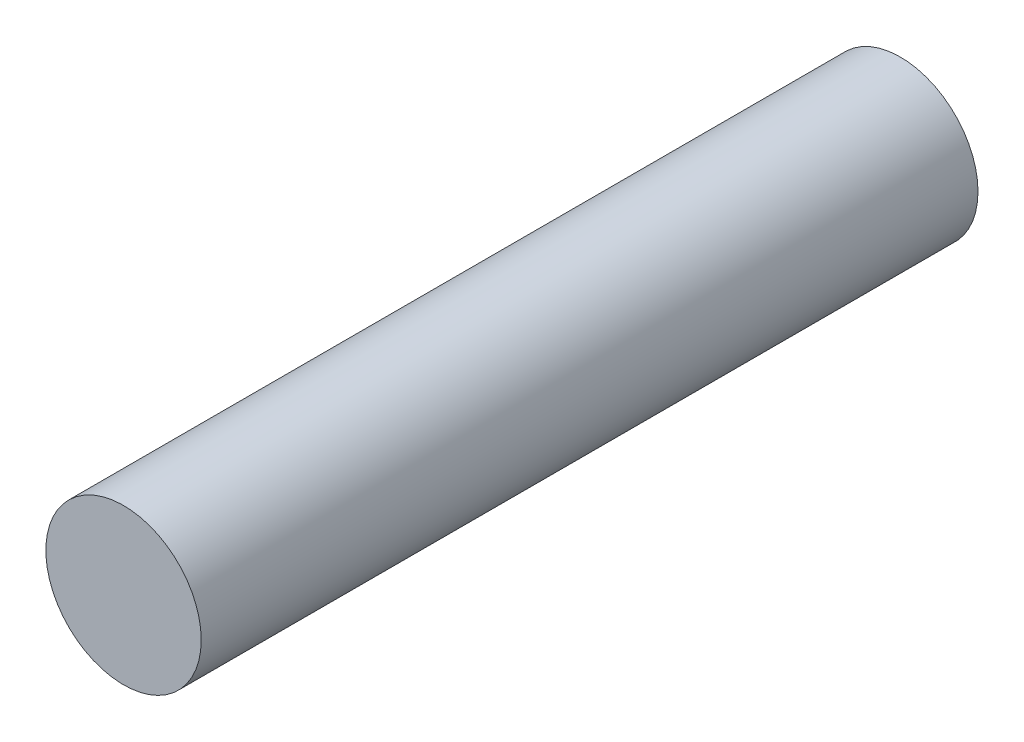
ISO-10303-21;
HEADER;
FILE_DESCRIPTION(('STEP AP214'),'2;1');
FILE_NAME('part.step','',(''),(''),'','','');
FILE_SCHEMA(('AUTOMOTIVE_DESIGN { 1 0 10303 214 1 1 1 1 }'));
ENDSEC;
DATA;
#1=APPLICATION_CONTEXT('core data for automotive mechanical design processes');
#2=APPLICATION_PROTOCOL_DEFINITION('international standard','automotive_design',2000,#1);
#3=PRODUCT_CONTEXT('',#1,'mechanical');
#4=PRODUCT('Part','Part','',(#3));
#5=PRODUCT_RELATED_PRODUCT_CATEGORY('part','',(#4));
#6=PRODUCT_DEFINITION_FORMATION('','',#4);
#7=PRODUCT_DEFINITION_CONTEXT('part definition',#1,'design');
#8=PRODUCT_DEFINITION('design','',#6,#7);
#9=PRODUCT_DEFINITION_SHAPE('','',#8);
#10=(LENGTH_UNIT() NAMED_UNIT(*) SI_UNIT(.MILLI.,.METRE.));
#11=(NAMED_UNIT(*) PLANE_ANGLE_UNIT() SI_UNIT($,.RADIAN.));
#12=(NAMED_UNIT(*) SI_UNIT($,.STERADIAN.) SOLID_ANGLE_UNIT());
#13=UNCERTAINTY_MEASURE_WITH_UNIT(LENGTH_MEASURE(1.E-05),#10,'distance_accuracy_value','');
#14=(GEOMETRIC_REPRESENTATION_CONTEXT(3) GLOBAL_UNCERTAINTY_ASSIGNED_CONTEXT((#13)) GLOBAL_UNIT_ASSIGNED_CONTEXT((#10,
#11,#12)) REPRESENTATION_CONTEXT('',''));
#15=CARTESIAN_POINT('',(0.,0.,0.));
#16=DIRECTION('',(0.,0.,1.));
#17=DIRECTION('',(1.,0.,0.));
#18=AXIS2_PLACEMENT_3D('',#15,#16,#17);
#19=CARTESIAN_POINT('',(0.,0.,5.));
#20=DIRECTION('',(0.,0.,-1.));
#21=DIRECTION('',(-1.,0.,0.));
#22=AXIS2_PLACEMENT_3D('',#19,#20,#21);
#23=CYLINDRICAL_SURFACE('',#22,1.);
#24=CARTESIAN_POINT('',(0.,0.,5.));
#25=DIRECTION('',(0.,0.,1.));
#26=DIRECTION('',(1.,0.,0.));
#27=AXIS2_PLACEMENT_3D('',#24,#25,#26);
#28=CIRCLE('',#27,1.);
#29=CARTESIAN_POINT('',(1.,0.,5.));
#30=VERTEX_POINT('',#29);
#31=EDGE_CURVE('E10',#30,#30,#28,.T.);
#32=ORIENTED_EDGE('',*,*,#31,.F.);
#33=EDGE_LOOP('',(#32));
#34=FACE_BOUND('',#33,.T.);
#35=CARTESIAN_POINT('',(0.,0.,-5.));
#36=DIRECTION('',(0.,0.,1.));
#37=DIRECTION('',(1.,0.,0.));
#38=AXIS2_PLACEMENT_3D('',#35,#36,#37);
#39=CIRCLE('',#38,1.);
#40=CARTESIAN_POINT('',(1.,0.,-5.));
#41=VERTEX_POINT('',#40);
#42=EDGE_CURVE('E38',#41,#41,#39,.T.);
#43=ORIENTED_EDGE('',*,*,#42,.T.);
#44=EDGE_LOOP('',(#43));
#45=FACE_BOUND('',#44,.T.);
#46=ADVANCED_FACE('F35',(#34,#45),#23,.T.);
#47=CARTESIAN_POINT('',(0.,0.,5.));
#48=DIRECTION('',(0.,0.,1.));
#49=DIRECTION('',(1.,0.,0.));
#50=AXIS2_PLACEMENT_3D('',#47,#48,#49);
#51=PLANE('',#50);
#52=ORIENTED_EDGE('',*,*,#31,.T.);
#53=EDGE_LOOP('',(#52));
#54=FACE_BOUND('',#53,.T.);
#55=ADVANCED_FACE('F50',(#54),#51,.T.);
#56=CARTESIAN_POINT('',(0.,0.,-5.));
#57=DIRECTION('',(0.,0.,1.));
#58=DIRECTION('',(1.,0.,0.));
#59=AXIS2_PLACEMENT_3D('',#56,#57,#58);
#60=PLANE('',#59);
#61=ORIENTED_EDGE('',*,*,#42,.F.);
#62=EDGE_LOOP('',(#61));
#63=FACE_BOUND('',#62,.T.);
#64=ADVANCED_FACE('F48',(#63),#60,.F.);
#65=CLOSED_SHELL('',(#46,#55,#64));
#66=MANIFOLD_SOLID_BREP('B2',#65);
#67=ADVANCED_BREP_SHAPE_REPRESENTATION('',(#18,#66),#14);
#68=SHAPE_DEFINITION_REPRESENTATION(#9,#67);
ENDSEC;
END-ISO-10303-21;
